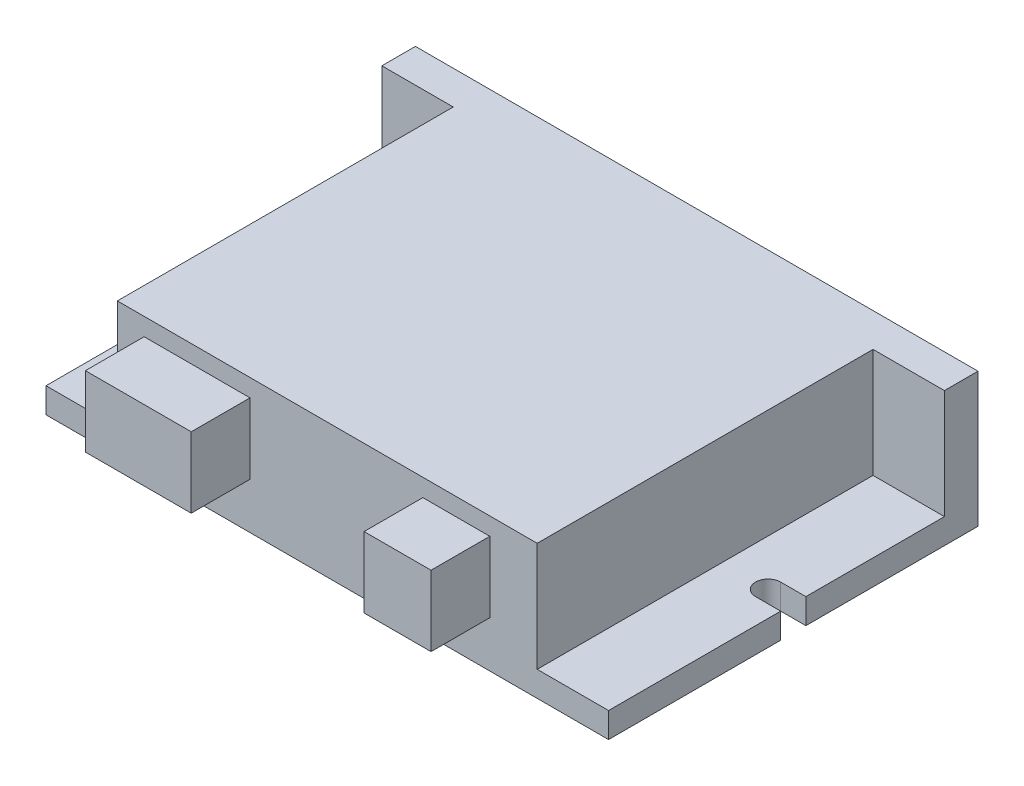
ISO-10303-21;
HEADER;
FILE_DESCRIPTION(('STEP AP214'),'2;1');
FILE_NAME('part.step','',(''),(''),'','','');
FILE_SCHEMA(('AUTOMOTIVE_DESIGN { 1 0 10303 214 1 1 1 1 }'));
ENDSEC;
DATA;
#1=APPLICATION_CONTEXT('core data for automotive mechanical design processes');
#2=APPLICATION_PROTOCOL_DEFINITION('international standard','automotive_design',2000,#1);
#3=PRODUCT_CONTEXT('',#1,'mechanical');
#4=PRODUCT('Part','Part','',(#3));
#5=PRODUCT_RELATED_PRODUCT_CATEGORY('part','',(#4));
#6=PRODUCT_DEFINITION_FORMATION('','',#4);
#7=PRODUCT_DEFINITION_CONTEXT('part definition',#1,'design');
#8=PRODUCT_DEFINITION('design','',#6,#7);
#9=PRODUCT_DEFINITION_SHAPE('','',#8);
#10=(LENGTH_UNIT() NAMED_UNIT(*) SI_UNIT(.MILLI.,.METRE.));
#11=(NAMED_UNIT(*) PLANE_ANGLE_UNIT() SI_UNIT($,.RADIAN.));
#12=(NAMED_UNIT(*) SI_UNIT($,.STERADIAN.) SOLID_ANGLE_UNIT());
#13=UNCERTAINTY_MEASURE_WITH_UNIT(LENGTH_MEASURE(1.E-05),#10,'distance_accuracy_value','');
#14=(GEOMETRIC_REPRESENTATION_CONTEXT(3) GLOBAL_UNCERTAINTY_ASSIGNED_CONTEXT((#13)) GLOBAL_UNIT_ASSIGNED_CONTEXT((#10,
#11,#12)) REPRESENTATION_CONTEXT('',''));
#15=CARTESIAN_POINT('',(0.,0.,0.));
#16=DIRECTION('',(0.,0.,1.));
#17=DIRECTION('',(1.,0.,0.));
#18=AXIS2_PLACEMENT_3D('',#15,#16,#17);
#19=CARTESIAN_POINT('',(-42.545,3.81,27.94));
#20=DIRECTION('',(0.,0.,-1.));
#21=DIRECTION('',(-1.,0.,0.));
#22=AXIS2_PLACEMENT_3D('',#19,#20,#21);
#23=PLANE('',#22);
#24=DIRECTION('',(0.,-1.,0.));
#25=VECTOR('',#24,1.);
#26=CARTESIAN_POINT('',(14.4555598641565,6.985,27.94));
#27=LINE('',#26,#25);
#28=CARTESIAN_POINT('',(14.4555598641565,17.653,27.94));
#29=VERTEX_POINT('',#28);
#30=CARTESIAN_POINT('',(14.4555598641565,6.985,27.94));
#31=VERTEX_POINT('',#30);
#32=EDGE_CURVE('E284',#29,#31,#27,.T.);
#33=ORIENTED_EDGE('',*,*,#32,.F.);
#34=DIRECTION('',(-1.,0.,0.));
#35=VECTOR('',#34,1.);
#36=CARTESIAN_POINT('',(14.4555598641565,17.653,27.94));
#37=LINE('',#36,#35);
#38=CARTESIAN_POINT('',(24.5831077929369,17.653,27.94));
#39=VERTEX_POINT('',#38);
#40=EDGE_CURVE('E271',#39,#29,#37,.T.);
#41=ORIENTED_EDGE('',*,*,#40,.F.);
#42=DIRECTION('',(0.,1.,0.));
#43=VECTOR('',#42,1.);
#44=CARTESIAN_POINT('',(24.5831077929369,6.985,27.94));
#45=LINE('',#44,#43);
#46=CARTESIAN_POINT('',(24.5831077929369,6.985,27.94));
#47=VERTEX_POINT('',#46);
#48=EDGE_CURVE('E275',#47,#39,#45,.T.);
#49=ORIENTED_EDGE('',*,*,#48,.F.);
#50=DIRECTION('',(1.,0.,0.));
#51=VECTOR('',#50,1.);
#52=CARTESIAN_POINT('',(14.4555598641565,6.985,27.94));
#53=LINE('',#52,#51);
#54=EDGE_CURVE('E280',#31,#47,#53,.T.);
#55=ORIENTED_EDGE('',*,*,#54,.F.);
#56=EDGE_LOOP('',(#33,#41,#49,#55));
#57=FACE_BOUND('',#56,.T.);
#58=DIRECTION('',(1.,0.,0.));
#59=VECTOR('',#58,1.);
#60=CARTESIAN_POINT('',(-42.545,0.,27.94));
#61=LINE('',#60,#59);
#62=CARTESIAN_POINT('',(-42.545,0.,27.94));
#63=VERTEX_POINT('',#62);
#64=CARTESIAN_POINT('',(42.545,0.,27.94));
#65=VERTEX_POINT('',#64);
#66=EDGE_CURVE('E461',#63,#65,#61,.T.);
#67=ORIENTED_EDGE('',*,*,#66,.T.);
#68=DIRECTION('',(0.,-1.,0.));
#69=VECTOR('',#68,1.);
#70=CARTESIAN_POINT('',(42.545,3.81,27.94));
#71=LINE('',#70,#69);
#72=CARTESIAN_POINT('',(42.545,3.81,27.94));
#73=VERTEX_POINT('',#72);
#74=EDGE_CURVE('E448',#73,#65,#71,.T.);
#75=ORIENTED_EDGE('',*,*,#74,.F.);
#76=DIRECTION('',(1.,0.,0.));
#77=VECTOR('',#76,1.);
#78=CARTESIAN_POINT('',(-42.545,3.81,27.94));
#79=LINE('',#78,#77);
#80=CARTESIAN_POINT('',(31.75,3.81,27.94));
#81=VERTEX_POINT('',#80);
#82=EDGE_CURVE('E444',#81,#73,#79,.T.);
#83=ORIENTED_EDGE('',*,*,#82,.F.);
#84=DIRECTION('',(0.,-1.,0.));
#85=VECTOR('',#84,1.);
#86=CARTESIAN_POINT('',(31.75,20.32,27.94));
#87=LINE('',#86,#85);
#88=CARTESIAN_POINT('',(31.75,20.32,27.94));
#89=VERTEX_POINT('',#88);
#90=EDGE_CURVE('E425',#89,#81,#87,.T.);
#91=ORIENTED_EDGE('',*,*,#90,.F.);
#92=DIRECTION('',(1.,0.,0.));
#93=VECTOR('',#92,1.);
#94=CARTESIAN_POINT('',(-31.75,20.32,27.94));
#95=LINE('',#94,#93);
#96=CARTESIAN_POINT('',(-31.75,20.32,27.94));
#97=VERTEX_POINT('',#96);
#98=EDGE_CURVE('E404',#97,#89,#95,.T.);
#99=ORIENTED_EDGE('',*,*,#98,.F.);
#100=DIRECTION('',(0.,-1.,0.));
#101=VECTOR('',#100,1.);
#102=CARTESIAN_POINT('',(-31.75,20.32,27.94));
#103=LINE('',#102,#101);
#104=CARTESIAN_POINT('',(-31.75,3.81,27.94));
#105=VERTEX_POINT('',#104);
#106=EDGE_CURVE('E429',#97,#105,#103,.T.);
#107=ORIENTED_EDGE('',*,*,#106,.T.);
#108=CARTESIAN_POINT('',(-42.545,3.81,27.94));
#109=VERTEX_POINT('',#108);
#110=EDGE_CURVE('E445',#109,#105,#79,.T.);
#111=ORIENTED_EDGE('',*,*,#110,.F.);
#112=DIRECTION('',(0.,-1.,0.));
#113=VECTOR('',#112,1.);
#114=CARTESIAN_POINT('',(-42.545,3.81,27.94));
#115=LINE('',#114,#113);
#116=EDGE_CURVE('E467',#109,#63,#115,.T.);
#117=ORIENTED_EDGE('',*,*,#116,.T.);
#118=EDGE_LOOP('',(#67,#75,#83,#91,#99,#107,#111,#117));
#119=FACE_BOUND('',#118,.T.);
#120=DIRECTION('',(0.,-1.,0.));
#121=VECTOR('',#120,1.);
#122=CARTESIAN_POINT('',(-27.6992763864077,6.985,27.94));
#123=LINE('',#122,#121);
#124=CARTESIAN_POINT('',(-27.6992763864077,17.653,27.94));
#125=VERTEX_POINT('',#124);
#126=CARTESIAN_POINT('',(-27.6992763864077,6.985,27.94));
#127=VERTEX_POINT('',#126);
#128=EDGE_CURVE('E241',#125,#127,#123,.T.);
#129=ORIENTED_EDGE('',*,*,#128,.F.);
#130=DIRECTION('',(-1.,0.,0.));
#131=VECTOR('',#130,1.);
#132=CARTESIAN_POINT('',(-27.6992763864077,17.653,27.94));
#133=LINE('',#132,#131);
#134=CARTESIAN_POINT('',(-11.6856322255158,17.653,27.94));
#135=VERTEX_POINT('',#134);
#136=EDGE_CURVE('E238',#135,#125,#133,.T.);
#137=ORIENTED_EDGE('',*,*,#136,.F.);
#138=DIRECTION('',(0.,1.,0.));
#139=VECTOR('',#138,1.);
#140=CARTESIAN_POINT('',(-11.6856322255158,6.985,27.94));
#141=LINE('',#140,#139);
#142=CARTESIAN_POINT('',(-11.6856322255158,6.985,27.94));
#143=VERTEX_POINT('',#142);
#144=EDGE_CURVE('E66',#143,#135,#141,.T.);
#145=ORIENTED_EDGE('',*,*,#144,.F.);
#146=DIRECTION('',(1.,0.,0.));
#147=VECTOR('',#146,1.);
#148=CARTESIAN_POINT('',(-27.6992763864077,6.985,27.94));
#149=LINE('',#148,#147);
#150=EDGE_CURVE('E61',#127,#143,#149,.T.);
#151=ORIENTED_EDGE('',*,*,#150,.F.);
#152=EDGE_LOOP('',(#129,#137,#145,#151));
#153=FACE_BOUND('',#152,.T.);
#154=ADVANCED_FACE('F45',(#57,#119,#153),#23,.F.);
#155=CARTESIAN_POINT('',(42.545,3.81,27.94));
#156=DIRECTION('',(-1.,0.,0.));
#157=DIRECTION('',(0.,0.,1.));
#158=AXIS2_PLACEMENT_3D('',#155,#156,#157);
#159=PLANE('',#158);
#160=DIRECTION('',(0.,0.,-1.));
#161=VECTOR('',#160,1.);
#162=CARTESIAN_POINT('',(42.545,3.81,27.94));
#163=LINE('',#162,#161);
#164=CARTESIAN_POINT('',(42.545,3.81,-1.905));
#165=VERTEX_POINT('',#164);
#166=CARTESIAN_POINT('',(42.545,3.81,-22.86));
#167=VERTEX_POINT('',#166);
#168=EDGE_CURVE('E439',#165,#167,#163,.T.);
#169=ORIENTED_EDGE('',*,*,#168,.F.);
#170=DIRECTION('',(0.,1.,0.));
#171=VECTOR('',#170,1.);
#172=CARTESIAN_POINT('',(42.545,0.,-1.905));
#173=LINE('',#172,#171);
#174=CARTESIAN_POINT('',(42.545,0.,-1.905));
#175=VERTEX_POINT('',#174);
#176=EDGE_CURVE('E318',#175,#165,#173,.T.);
#177=ORIENTED_EDGE('',*,*,#176,.F.);
#178=DIRECTION('',(0.,0.,-1.));
#179=VECTOR('',#178,1.);
#180=CARTESIAN_POINT('',(42.545,0.,27.94));
#181=LINE('',#180,#179);
#182=CARTESIAN_POINT('',(42.545,0.,-27.94));
#183=VERTEX_POINT('',#182);
#184=EDGE_CURVE('E433',#175,#183,#181,.T.);
#185=ORIENTED_EDGE('',*,*,#184,.T.);
#186=DIRECTION('',(0.,-1.,0.));
#187=VECTOR('',#186,1.);
#188=CARTESIAN_POINT('',(42.545,3.81,-27.94));
#189=LINE('',#188,#187);
#190=CARTESIAN_POINT('',(42.545,20.32,-27.94));
#191=VERTEX_POINT('',#190);
#192=EDGE_CURVE('E11',#191,#183,#189,.T.);
#193=ORIENTED_EDGE('',*,*,#192,.F.);
#194=DIRECTION('',(0.,0.,1.));
#195=VECTOR('',#194,1.);
#196=CARTESIAN_POINT('',(42.545,20.32,-27.94));
#197=LINE('',#196,#195);
#198=CARTESIAN_POINT('',(42.545,20.32,-22.86));
#199=VERTEX_POINT('',#198);
#200=EDGE_CURVE('E373',#191,#199,#197,.T.);
#201=ORIENTED_EDGE('',*,*,#200,.T.);
#202=DIRECTION('',(0.,-1.,0.));
#203=VECTOR('',#202,1.);
#204=CARTESIAN_POINT('',(42.545,105.561506908313,-22.86));
#205=LINE('',#204,#203);
#206=EDGE_CURVE('E390',#199,#167,#205,.T.);
#207=ORIENTED_EDGE('',*,*,#206,.T.);
#208=EDGE_LOOP('',(#169,#177,#185,#193,#201,#207));
#209=FACE_BOUND('',#208,.T.);
#210=ADVANCED_FACE('F503',(#209),#159,.F.);
#211=CARTESIAN_POINT('',(-42.545,3.81,27.94));
#212=DIRECTION('',(1.,0.,0.));
#213=DIRECTION('',(0.,0.,-1.));
#214=AXIS2_PLACEMENT_3D('',#211,#212,#213);
#215=PLANE('',#214);
#216=DIRECTION('',(0.,0.,1.));
#217=VECTOR('',#216,1.);
#218=CARTESIAN_POINT('',(-42.545,3.81,27.94));
#219=LINE('',#218,#217);
#220=CARTESIAN_POINT('',(-42.545,3.81,1.905));
#221=VERTEX_POINT('',#220);
#222=EDGE_CURVE('E438',#221,#109,#219,.T.);
#223=ORIENTED_EDGE('',*,*,#222,.F.);
#224=DIRECTION('',(0.,1.,0.));
#225=VECTOR('',#224,1.);
#226=CARTESIAN_POINT('',(-42.545,0.,1.905));
#227=LINE('',#226,#225);
#228=CARTESIAN_POINT('',(-42.545,0.,1.905));
#229=VERTEX_POINT('',#228);
#230=EDGE_CURVE('E248',#229,#221,#227,.T.);
#231=ORIENTED_EDGE('',*,*,#230,.F.);
#232=DIRECTION('',(0.,0.,1.));
#233=VECTOR('',#232,1.);
#234=CARTESIAN_POINT('',(-42.545,0.,27.94));
#235=LINE('',#234,#233);
#236=EDGE_CURVE('E456',#229,#63,#235,.T.);
#237=ORIENTED_EDGE('',*,*,#236,.T.);
#238=ORIENTED_EDGE('',*,*,#116,.F.);
#239=EDGE_LOOP('',(#223,#231,#237,#238));
#240=FACE_BOUND('',#239,.T.);
#241=ADVANCED_FACE('F522',(#240),#215,.F.);
#242=CARTESIAN_POINT('',(0.,3.81,0.));
#243=DIRECTION('',(0.,-1.,0.));
#244=DIRECTION('',(0.,0.,-1.));
#245=AXIS2_PLACEMENT_3D('',#242,#243,#244);
#246=PLANE('',#245);
#247=CARTESIAN_POINT('',(-38.735,3.81,0.));
#248=DIRECTION('',(0.,-1.,0.));
#249=DIRECTION('',(0.,0.,-1.));
#250=AXIS2_PLACEMENT_3D('',#247,#248,#249);
#251=CIRCLE('',#250,1.905);
#252=CARTESIAN_POINT('',(-38.735,3.81,-1.905));
#253=VERTEX_POINT('',#252);
#254=CARTESIAN_POINT('',(-38.735,3.81,1.905));
#255=VERTEX_POINT('',#254);
#256=EDGE_CURVE('E356',#253,#255,#251,.T.);
#257=ORIENTED_EDGE('',*,*,#256,.T.);
#258=DIRECTION('',(-1.,0.,0.));
#259=VECTOR('',#258,1.);
#260=CARTESIAN_POINT('',(0.,3.81,1.905));
#261=LINE('',#260,#259);
#262=EDGE_CURVE('E352',#255,#221,#261,.T.);
#263=ORIENTED_EDGE('',*,*,#262,.T.);
#264=ORIENTED_EDGE('',*,*,#222,.T.);
#265=ORIENTED_EDGE('',*,*,#110,.T.);
#266=DIRECTION('',(0.,0.,1.));
#267=VECTOR('',#266,1.);
#268=CARTESIAN_POINT('',(-31.75,3.81,27.94));
#269=LINE('',#268,#267);
#270=CARTESIAN_POINT('',(-31.75,3.81,-22.86));
#271=VERTEX_POINT('',#270);
#272=EDGE_CURVE('E386',#271,#105,#269,.T.);
#273=ORIENTED_EDGE('',*,*,#272,.F.);
#274=DIRECTION('',(1.,0.,0.));
#275=VECTOR('',#274,1.);
#276=CARTESIAN_POINT('',(-42.545,3.81,-22.86));
#277=LINE('',#276,#275);
#278=CARTESIAN_POINT('',(-42.545,3.81,-22.86));
#279=VERTEX_POINT('',#278);
#280=EDGE_CURVE('E387',#279,#271,#277,.T.);
#281=ORIENTED_EDGE('',*,*,#280,.F.);
#282=CARTESIAN_POINT('',(-42.545,3.81,-1.905));
#283=VERTEX_POINT('',#282);
#284=EDGE_CURVE('E440',#279,#283,#219,.T.);
#285=ORIENTED_EDGE('',*,*,#284,.T.);
#286=DIRECTION('',(1.,0.,0.));
#287=VECTOR('',#286,1.);
#288=CARTESIAN_POINT('',(0.,3.81,-1.905));
#289=LINE('',#288,#287);
#290=EDGE_CURVE('E317',#283,#253,#289,.T.);
#291=ORIENTED_EDGE('',*,*,#290,.T.);
#292=EDGE_LOOP('',(#257,#263,#264,#265,#273,#281,#285,#291));
#293=FACE_BOUND('',#292,.T.);
#294=ADVANCED_FACE('F490',(#293),#246,.F.);
#295=CARTESIAN_POINT('',(38.735,3.81,0.));
#296=DIRECTION('',(0.,-1.,0.));
#297=DIRECTION('',(0.,0.,-1.));
#298=AXIS2_PLACEMENT_3D('',#295,#296,#297);
#299=CIRCLE('',#298,1.905);
#300=CARTESIAN_POINT('',(38.735,3.81,1.905));
#301=VERTEX_POINT('',#300);
#302=CARTESIAN_POINT('',(38.735,3.81,-1.905));
#303=VERTEX_POINT('',#302);
#304=EDGE_CURVE('E368',#301,#303,#299,.T.);
#305=ORIENTED_EDGE('',*,*,#304,.T.);
#306=DIRECTION('',(1.,0.,0.));
#307=VECTOR('',#306,1.);
#308=CARTESIAN_POINT('',(0.,3.81,-1.905));
#309=LINE('',#308,#307);
#310=EDGE_CURVE('E364',#303,#165,#309,.T.);
#311=ORIENTED_EDGE('',*,*,#310,.T.);
#312=ORIENTED_EDGE('',*,*,#168,.T.);
#313=CARTESIAN_POINT('',(31.75,3.81,-22.86));
#314=VERTEX_POINT('',#313);
#315=EDGE_CURVE('E372',#314,#167,#277,.T.);
#316=ORIENTED_EDGE('',*,*,#315,.F.);
#317=DIRECTION('',(0.,0.,-1.));
#318=VECTOR('',#317,1.);
#319=CARTESIAN_POINT('',(31.75,3.81,27.94));
#320=LINE('',#319,#318);
#321=EDGE_CURVE('E405',#81,#314,#320,.T.);
#322=ORIENTED_EDGE('',*,*,#321,.F.);
#323=ORIENTED_EDGE('',*,*,#82,.T.);
#324=CARTESIAN_POINT('',(42.545,3.81,1.905));
#325=VERTEX_POINT('',#324);
#326=EDGE_CURVE('E434',#73,#325,#163,.T.);
#327=ORIENTED_EDGE('',*,*,#326,.T.);
#328=DIRECTION('',(-1.,0.,0.));
#329=VECTOR('',#328,1.);
#330=CARTESIAN_POINT('',(0.,3.81,1.905));
#331=LINE('',#330,#329);
#332=EDGE_CURVE('E360',#325,#301,#331,.T.);
#333=ORIENTED_EDGE('',*,*,#332,.T.);
#334=EDGE_LOOP('',(#305,#311,#312,#316,#322,#323,#327,#333));
#335=FACE_BOUND('',#334,.T.);
#336=ADVANCED_FACE('F563',(#335),#246,.F.);
#337=CARTESIAN_POINT('',(42.545,0.,1.90500000000001));
#338=VERTEX_POINT('',#337);
#339=EDGE_CURVE('E449',#65,#338,#181,.T.);
#340=ORIENTED_EDGE('',*,*,#339,.T.);
#341=DIRECTION('',(0.,1.,0.));
#342=VECTOR('',#341,1.);
#343=CARTESIAN_POINT('',(42.545,0.,1.905));
#344=LINE('',#343,#342);
#345=EDGE_CURVE('E321',#338,#325,#344,.T.);
#346=ORIENTED_EDGE('',*,*,#345,.T.);
#347=ORIENTED_EDGE('',*,*,#326,.F.);
#348=ORIENTED_EDGE('',*,*,#74,.T.);
#349=EDGE_LOOP('',(#340,#346,#347,#348));
#350=FACE_BOUND('',#349,.T.);
#351=ADVANCED_FACE('F47',(#350),#159,.F.);
#352=CARTESIAN_POINT('',(-42.545,3.81,-27.94));
#353=DIRECTION('',(0.,0.,1.));
#354=DIRECTION('',(1.,0.,0.));
#355=AXIS2_PLACEMENT_3D('',#352,#353,#354);
#356=PLANE('',#355);
#357=DIRECTION('',(-1.,0.,0.));
#358=VECTOR('',#357,1.);
#359=CARTESIAN_POINT('',(-42.545,0.,-27.94));
#360=LINE('',#359,#358);
#361=CARTESIAN_POINT('',(-42.545,0.,-27.94));
#362=VERTEX_POINT('',#361);
#363=EDGE_CURVE('E453',#183,#362,#360,.T.);
#364=ORIENTED_EDGE('',*,*,#363,.T.);
#365=DIRECTION('',(0.,-1.,0.));
#366=VECTOR('',#365,1.);
#367=CARTESIAN_POINT('',(-42.545,3.81,-27.94));
#368=LINE('',#367,#366);
#369=CARTESIAN_POINT('',(-42.545,20.32,-27.94));
#370=VERTEX_POINT('',#369);
#371=EDGE_CURVE('E54',#370,#362,#368,.T.);
#372=ORIENTED_EDGE('',*,*,#371,.F.);
#373=DIRECTION('',(1.,0.,0.));
#374=VECTOR('',#373,1.);
#375=CARTESIAN_POINT('',(-42.545,20.32,-27.94));
#376=LINE('',#375,#374);
#377=EDGE_CURVE('E378',#370,#191,#376,.T.);
#378=ORIENTED_EDGE('',*,*,#377,.T.);
#379=ORIENTED_EDGE('',*,*,#192,.T.);
#380=EDGE_LOOP('',(#364,#372,#378,#379));
#381=FACE_BOUND('',#380,.T.);
#382=ADVANCED_FACE('F500',(#381),#356,.F.);
#383=CARTESIAN_POINT('',(-42.545,0.,-1.905));
#384=VERTEX_POINT('',#383);
#385=EDGE_CURVE('E457',#362,#384,#235,.T.);
#386=ORIENTED_EDGE('',*,*,#385,.T.);
#387=DIRECTION('',(0.,1.,0.));
#388=VECTOR('',#387,1.);
#389=CARTESIAN_POINT('',(-42.545,0.,-1.905));
#390=LINE('',#389,#388);
#391=EDGE_CURVE('E333',#384,#283,#390,.T.);
#392=ORIENTED_EDGE('',*,*,#391,.T.);
#393=ORIENTED_EDGE('',*,*,#284,.F.);
#394=DIRECTION('',(0.,-1.,0.));
#395=VECTOR('',#394,1.);
#396=CARTESIAN_POINT('',(-42.545,105.561506908313,-22.86));
#397=LINE('',#396,#395);
#398=CARTESIAN_POINT('',(-42.545,20.32,-22.86));
#399=VERTEX_POINT('',#398);
#400=EDGE_CURVE('E394',#399,#279,#397,.T.);
#401=ORIENTED_EDGE('',*,*,#400,.F.);
#402=DIRECTION('',(0.,0.,-1.));
#403=VECTOR('',#402,1.);
#404=CARTESIAN_POINT('',(-42.545,20.32,-27.94));
#405=LINE('',#404,#403);
#406=EDGE_CURVE('E382',#399,#370,#405,.T.);
#407=ORIENTED_EDGE('',*,*,#406,.T.);
#408=ORIENTED_EDGE('',*,*,#371,.T.);
#409=EDGE_LOOP('',(#386,#392,#393,#401,#407,#408));
#410=FACE_BOUND('',#409,.T.);
#411=ADVANCED_FACE('F474',(#410),#215,.F.);
#412=CARTESIAN_POINT('',(0.,0.,0.));
#413=DIRECTION('',(0.,-1.,0.));
#414=DIRECTION('',(0.,0.,-1.));
#415=AXIS2_PLACEMENT_3D('',#412,#413,#414);
#416=PLANE('',#415);
#417=DIRECTION('',(-1.,0.,0.));
#418=VECTOR('',#417,1.);
#419=CARTESIAN_POINT('',(38.735,0.,-1.905));
#420=LINE('',#419,#418);
#421=CARTESIAN_POINT('',(38.735,0.,-1.905));
#422=VERTEX_POINT('',#421);
#423=EDGE_CURVE('E308',#175,#422,#420,.T.);
#424=ORIENTED_EDGE('',*,*,#423,.T.);
#425=CARTESIAN_POINT('',(38.735,0.,0.));
#426=DIRECTION('',(0.,1.,0.));
#427=DIRECTION('',(0.,0.,1.));
#428=AXIS2_PLACEMENT_3D('',#425,#426,#427);
#429=CIRCLE('',#428,1.905);
#430=CARTESIAN_POINT('',(38.735,0.,1.905));
#431=VERTEX_POINT('',#430);
#432=EDGE_CURVE('E299',#422,#431,#429,.T.);
#433=ORIENTED_EDGE('',*,*,#432,.T.);
#434=DIRECTION('',(1.,0.,0.));
#435=VECTOR('',#434,1.);
#436=CARTESIAN_POINT('',(38.735,0.,1.905));
#437=LINE('',#436,#435);
#438=EDGE_CURVE('E303',#431,#338,#437,.T.);
#439=ORIENTED_EDGE('',*,*,#438,.T.);
#440=ORIENTED_EDGE('',*,*,#339,.F.);
#441=ORIENTED_EDGE('',*,*,#66,.F.);
#442=ORIENTED_EDGE('',*,*,#236,.F.);
#443=DIRECTION('',(1.,0.,0.));
#444=VECTOR('',#443,1.);
#445=CARTESIAN_POINT('',(-38.735,0.,1.905));
#446=LINE('',#445,#444);
#447=CARTESIAN_POINT('',(-38.735,0.,1.905));
#448=VERTEX_POINT('',#447);
#449=EDGE_CURVE('E332',#229,#448,#446,.T.);
#450=ORIENTED_EDGE('',*,*,#449,.T.);
#451=CARTESIAN_POINT('',(-38.735,0.,0.));
#452=DIRECTION('',(0.,1.,0.));
#453=DIRECTION('',(0.,0.,-1.));
#454=AXIS2_PLACEMENT_3D('',#451,#452,#453);
#455=CIRCLE('',#454,1.905);
#456=CARTESIAN_POINT('',(-38.735,0.,-1.905));
#457=VERTEX_POINT('',#456);
#458=EDGE_CURVE('E304',#448,#457,#455,.T.);
#459=ORIENTED_EDGE('',*,*,#458,.T.);
#460=DIRECTION('',(-1.,0.,0.));
#461=VECTOR('',#460,1.);
#462=CARTESIAN_POINT('',(-38.735,0.,-1.905));
#463=LINE('',#462,#461);
#464=EDGE_CURVE('E342',#457,#384,#463,.T.);
#465=ORIENTED_EDGE('',*,*,#464,.T.);
#466=ORIENTED_EDGE('',*,*,#385,.F.);
#467=ORIENTED_EDGE('',*,*,#363,.F.);
#468=ORIENTED_EDGE('',*,*,#184,.F.);
#469=EDGE_LOOP('',(#424,#433,#439,#440,#441,#442,#450,#459,#465,#466,#467,#468));
#470=FACE_BOUND('',#469,.T.);
#471=ADVANCED_FACE('F481',(#470),#416,.T.);
#472=CARTESIAN_POINT('',(-31.75,20.32,27.94));
#473=DIRECTION('',(1.,0.,0.));
#474=DIRECTION('',(0.,0.,-1.));
#475=AXIS2_PLACEMENT_3D('',#472,#473,#474);
#476=PLANE('',#475);
#477=ORIENTED_EDGE('',*,*,#272,.T.);
#478=ORIENTED_EDGE('',*,*,#106,.F.);
#479=DIRECTION('',(0.,0.,1.));
#480=VECTOR('',#479,1.);
#481=CARTESIAN_POINT('',(-31.75,20.32,27.94));
#482=LINE('',#481,#480);
#483=CARTESIAN_POINT('',(-31.75,20.32,-22.86));
#484=VERTEX_POINT('',#483);
#485=EDGE_CURVE('E400',#484,#97,#482,.T.);
#486=ORIENTED_EDGE('',*,*,#485,.F.);
#487=DIRECTION('',(0.,-1.,0.));
#488=VECTOR('',#487,1.);
#489=CARTESIAN_POINT('',(-31.75,20.32,-22.86));
#490=LINE('',#489,#488);
#491=EDGE_CURVE('E412',#484,#271,#490,.T.);
#492=ORIENTED_EDGE('',*,*,#491,.T.);
#493=EDGE_LOOP('',(#477,#478,#486,#492));
#494=FACE_BOUND('',#493,.T.);
#495=ADVANCED_FACE('F539',(#494),#476,.F.);
#496=CARTESIAN_POINT('',(31.75,20.32,27.94));
#497=DIRECTION('',(-1.,0.,0.));
#498=DIRECTION('',(0.,0.,1.));
#499=AXIS2_PLACEMENT_3D('',#496,#497,#498);
#500=PLANE('',#499);
#501=ORIENTED_EDGE('',*,*,#321,.T.);
#502=DIRECTION('',(0.,-1.,0.));
#503=VECTOR('',#502,1.);
#504=CARTESIAN_POINT('',(31.75,20.32,-22.86));
#505=LINE('',#504,#503);
#506=CARTESIAN_POINT('',(31.75,20.32,-22.86));
#507=VERTEX_POINT('',#506);
#508=EDGE_CURVE('E422',#507,#314,#505,.T.);
#509=ORIENTED_EDGE('',*,*,#508,.F.);
#510=DIRECTION('',(0.,0.,-1.));
#511=VECTOR('',#510,1.);
#512=CARTESIAN_POINT('',(31.75,20.32,27.94));
#513=LINE('',#512,#511);
#514=EDGE_CURVE('E408',#89,#507,#513,.T.);
#515=ORIENTED_EDGE('',*,*,#514,.F.);
#516=ORIENTED_EDGE('',*,*,#90,.T.);
#517=EDGE_LOOP('',(#501,#509,#515,#516));
#518=FACE_BOUND('',#517,.T.);
#519=ADVANCED_FACE('F536',(#518),#500,.F.);
#520=CARTESIAN_POINT('',(0.,20.32,0.));
#521=DIRECTION('',(0.,-1.,0.));
#522=DIRECTION('',(0.,0.,-1.));
#523=AXIS2_PLACEMENT_3D('',#520,#521,#522);
#524=PLANE('',#523);
#525=ORIENTED_EDGE('',*,*,#485,.T.);
#526=ORIENTED_EDGE('',*,*,#98,.T.);
#527=ORIENTED_EDGE('',*,*,#514,.T.);
#528=DIRECTION('',(-1.,0.,0.));
#529=VECTOR('',#528,1.);
#530=CARTESIAN_POINT('',(-42.545,20.32,-22.86));
#531=LINE('',#530,#529);
#532=EDGE_CURVE('E379',#199,#507,#531,.T.);
#533=ORIENTED_EDGE('',*,*,#532,.F.);
#534=ORIENTED_EDGE('',*,*,#200,.F.);
#535=ORIENTED_EDGE('',*,*,#377,.F.);
#536=ORIENTED_EDGE('',*,*,#406,.F.);
#537=EDGE_CURVE('E377',#484,#399,#531,.T.);
#538=ORIENTED_EDGE('',*,*,#537,.F.);
#539=EDGE_LOOP('',(#525,#526,#527,#533,#534,#535,#536,#538));
#540=FACE_BOUND('',#539,.T.);
#541=ADVANCED_FACE('F498',(#540),#524,.F.);
#542=CARTESIAN_POINT('',(-42.545,105.561506908313,-22.86));
#543=DIRECTION('',(0.,0.,-1.));
#544=DIRECTION('',(-1.,0.,0.));
#545=AXIS2_PLACEMENT_3D('',#542,#543,#544);
#546=PLANE('',#545);
#547=ORIENTED_EDGE('',*,*,#280,.T.);
#548=ORIENTED_EDGE('',*,*,#491,.F.);
#549=ORIENTED_EDGE('',*,*,#537,.T.);
#550=ORIENTED_EDGE('',*,*,#400,.T.);
#551=EDGE_LOOP('',(#547,#548,#549,#550));
#552=FACE_BOUND('',#551,.T.);
#553=ADVANCED_FACE('F494',(#552),#546,.F.);
#554=ORIENTED_EDGE('',*,*,#532,.T.);
#555=ORIENTED_EDGE('',*,*,#508,.T.);
#556=ORIENTED_EDGE('',*,*,#315,.T.);
#557=ORIENTED_EDGE('',*,*,#206,.F.);
#558=EDGE_LOOP('',(#554,#555,#556,#557));
#559=FACE_BOUND('',#558,.T.);
#560=ADVANCED_FACE('F511',(#559),#546,.F.);
#561=CARTESIAN_POINT('',(-38.735,0.,0.));
#562=DIRECTION('',(0.,1.,0.));
#563=DIRECTION('',(0.,0.,1.));
#564=AXIS2_PLACEMENT_3D('',#561,#562,#563);
#565=CYLINDRICAL_SURFACE('',#564,1.905);
#566=DIRECTION('',(0.,1.,0.));
#567=VECTOR('',#566,1.);
#568=CARTESIAN_POINT('',(-38.735,0.,-1.905));
#569=LINE('',#568,#567);
#570=EDGE_CURVE('E328',#457,#253,#569,.T.);
#571=ORIENTED_EDGE('',*,*,#570,.F.);
#572=ORIENTED_EDGE('',*,*,#458,.F.);
#573=DIRECTION('',(0.,1.,0.));
#574=VECTOR('',#573,1.);
#575=CARTESIAN_POINT('',(-38.735,0.,1.905));
#576=LINE('',#575,#574);
#577=EDGE_CURVE('E243',#448,#255,#576,.T.);
#578=ORIENTED_EDGE('',*,*,#577,.T.);
#579=ORIENTED_EDGE('',*,*,#256,.F.);
#580=EDGE_LOOP('',(#571,#572,#578,#579));
#581=FACE_BOUND('',#580,.T.);
#582=ADVANCED_FACE('F589',(#581),#565,.F.);
#583=CARTESIAN_POINT('',(-38.735,0.,1.905));
#584=DIRECTION('',(0.,0.,1.));
#585=DIRECTION('',(1.,0.,0.));
#586=AXIS2_PLACEMENT_3D('',#583,#584,#585);
#587=PLANE('',#586);
#588=ORIENTED_EDGE('',*,*,#577,.F.);
#589=ORIENTED_EDGE('',*,*,#449,.F.);
#590=ORIENTED_EDGE('',*,*,#230,.T.);
#591=ORIENTED_EDGE('',*,*,#262,.F.);
#592=EDGE_LOOP('',(#588,#589,#590,#591));
#593=FACE_BOUND('',#592,.T.);
#594=ADVANCED_FACE('F592',(#593),#587,.F.);
#595=CARTESIAN_POINT('',(-38.735,0.,-1.905));
#596=DIRECTION('',(0.,0.,-1.));
#597=DIRECTION('',(-1.,0.,0.));
#598=AXIS2_PLACEMENT_3D('',#595,#596,#597);
#599=PLANE('',#598);
#600=ORIENTED_EDGE('',*,*,#391,.F.);
#601=ORIENTED_EDGE('',*,*,#464,.F.);
#602=ORIENTED_EDGE('',*,*,#570,.T.);
#603=ORIENTED_EDGE('',*,*,#290,.F.);
#604=EDGE_LOOP('',(#600,#601,#602,#603));
#605=FACE_BOUND('',#604,.T.);
#606=ADVANCED_FACE('F486',(#605),#599,.F.);
#607=CARTESIAN_POINT('',(38.735,0.,0.));
#608=DIRECTION('',(0.,1.,0.));
#609=DIRECTION('',(0.,0.,1.));
#610=AXIS2_PLACEMENT_3D('',#607,#608,#609);
#611=CYLINDRICAL_SURFACE('',#610,1.905);
#612=DIRECTION('',(0.,1.,0.));
#613=VECTOR('',#612,1.);
#614=CARTESIAN_POINT('',(38.735,0.,1.905));
#615=LINE('',#614,#613);
#616=EDGE_CURVE('E312',#431,#301,#615,.T.);
#617=ORIENTED_EDGE('',*,*,#616,.F.);
#618=ORIENTED_EDGE('',*,*,#432,.F.);
#619=DIRECTION('',(0.,1.,0.));
#620=VECTOR('',#619,1.);
#621=CARTESIAN_POINT('',(38.735,0.,-1.905));
#622=LINE('',#621,#620);
#623=EDGE_CURVE('E313',#422,#303,#622,.T.);
#624=ORIENTED_EDGE('',*,*,#623,.T.);
#625=ORIENTED_EDGE('',*,*,#304,.F.);
#626=EDGE_LOOP('',(#617,#618,#624,#625));
#627=FACE_BOUND('',#626,.T.);
#628=ADVANCED_FACE('F571',(#627),#611,.F.);
#629=CARTESIAN_POINT('',(38.735,0.,-1.905));
#630=DIRECTION('',(0.,0.,-1.));
#631=DIRECTION('',(-1.,0.,0.));
#632=AXIS2_PLACEMENT_3D('',#629,#630,#631);
#633=PLANE('',#632);
#634=ORIENTED_EDGE('',*,*,#623,.F.);
#635=ORIENTED_EDGE('',*,*,#423,.F.);
#636=ORIENTED_EDGE('',*,*,#176,.T.);
#637=ORIENTED_EDGE('',*,*,#310,.F.);
#638=EDGE_LOOP('',(#634,#635,#636,#637));
#639=FACE_BOUND('',#638,.T.);
#640=ADVANCED_FACE('F576',(#639),#633,.F.);
#641=CARTESIAN_POINT('',(38.735,0.,1.905));
#642=DIRECTION('',(0.,0.,1.));
#643=DIRECTION('',(1.,0.,0.));
#644=AXIS2_PLACEMENT_3D('',#641,#642,#643);
#645=PLANE('',#644);
#646=ORIENTED_EDGE('',*,*,#345,.F.);
#647=ORIENTED_EDGE('',*,*,#438,.F.);
#648=ORIENTED_EDGE('',*,*,#616,.T.);
#649=ORIENTED_EDGE('',*,*,#332,.F.);
#650=EDGE_LOOP('',(#646,#647,#648,#649));
#651=FACE_BOUND('',#650,.T.);
#652=ADVANCED_FACE('F574',(#651),#645,.F.);
#653=CARTESIAN_POINT('',(14.4555598641565,6.985,36.83));
#654=DIRECTION('',(1.,0.,0.));
#655=DIRECTION('',(0.,0.,-1.));
#656=AXIS2_PLACEMENT_3D('',#653,#654,#655);
#657=PLANE('',#656);
#658=ORIENTED_EDGE('',*,*,#32,.T.);
#659=DIRECTION('',(0.,0.,-1.));
#660=VECTOR('',#659,1.);
#661=CARTESIAN_POINT('',(14.4555598641565,6.985,36.83));
#662=LINE('',#661,#660);
#663=CARTESIAN_POINT('',(14.4555598641565,6.985,36.83));
#664=VERTEX_POINT('',#663);
#665=EDGE_CURVE('E254',#664,#31,#662,.T.);
#666=ORIENTED_EDGE('',*,*,#665,.F.);
#667=DIRECTION('',(0.,-1.,0.));
#668=VECTOR('',#667,1.);
#669=CARTESIAN_POINT('',(14.4555598641565,6.985,36.83));
#670=LINE('',#669,#668);
#671=CARTESIAN_POINT('',(14.4555598641565,17.653,36.83));
#672=VERTEX_POINT('',#671);
#673=EDGE_CURVE('E276',#672,#664,#670,.T.);
#674=ORIENTED_EDGE('',*,*,#673,.F.);
#675=DIRECTION('',(0.,0.,-1.));
#676=VECTOR('',#675,1.);
#677=CARTESIAN_POINT('',(14.4555598641565,17.653,36.83));
#678=LINE('',#677,#676);
#679=EDGE_CURVE('E266',#672,#29,#678,.T.);
#680=ORIENTED_EDGE('',*,*,#679,.T.);
#681=EDGE_LOOP('',(#658,#666,#674,#680));
#682=FACE_BOUND('',#681,.T.);
#683=ADVANCED_FACE('F582',(#682),#657,.F.);
#684=CARTESIAN_POINT('',(14.4555598641565,6.985,36.83));
#685=DIRECTION('',(0.,1.,0.));
#686=DIRECTION('',(0.,0.,1.));
#687=AXIS2_PLACEMENT_3D('',#684,#685,#686);
#688=PLANE('',#687);
#689=ORIENTED_EDGE('',*,*,#54,.T.);
#690=DIRECTION('',(0.,0.,-1.));
#691=VECTOR('',#690,1.);
#692=CARTESIAN_POINT('',(24.5831077929369,6.985,36.83));
#693=LINE('',#692,#691);
#694=CARTESIAN_POINT('',(24.5831077929369,6.985,36.83));
#695=VERTEX_POINT('',#694);
#696=EDGE_CURVE('E258',#695,#47,#693,.T.);
#697=ORIENTED_EDGE('',*,*,#696,.F.);
#698=DIRECTION('',(1.,0.,0.));
#699=VECTOR('',#698,1.);
#700=CARTESIAN_POINT('',(14.4555598641565,6.985,36.83));
#701=LINE('',#700,#699);
#702=EDGE_CURVE('E293',#664,#695,#701,.T.);
#703=ORIENTED_EDGE('',*,*,#702,.F.);
#704=ORIENTED_EDGE('',*,*,#665,.T.);
#705=EDGE_LOOP('',(#689,#697,#703,#704));
#706=FACE_BOUND('',#705,.T.);
#707=ADVANCED_FACE('F707',(#706),#688,.F.);
#708=CARTESIAN_POINT('',(24.5831077929369,6.985,36.83));
#709=DIRECTION('',(-1.,0.,0.));
#710=DIRECTION('',(0.,0.,1.));
#711=AXIS2_PLACEMENT_3D('',#708,#709,#710);
#712=PLANE('',#711);
#713=ORIENTED_EDGE('',*,*,#48,.T.);
#714=DIRECTION('',(0.,0.,-1.));
#715=VECTOR('',#714,1.);
#716=CARTESIAN_POINT('',(24.5831077929369,17.653,36.83));
#717=LINE('',#716,#715);
#718=CARTESIAN_POINT('',(24.5831077929369,17.653,36.83));
#719=VERTEX_POINT('',#718);
#720=EDGE_CURVE('E262',#719,#39,#717,.T.);
#721=ORIENTED_EDGE('',*,*,#720,.F.);
#722=DIRECTION('',(0.,1.,0.));
#723=VECTOR('',#722,1.);
#724=CARTESIAN_POINT('',(24.5831077929369,6.985,36.83));
#725=LINE('',#724,#723);
#726=EDGE_CURVE('E290',#695,#719,#725,.T.);
#727=ORIENTED_EDGE('',*,*,#726,.F.);
#728=ORIENTED_EDGE('',*,*,#696,.T.);
#729=EDGE_LOOP('',(#713,#721,#727,#728));
#730=FACE_BOUND('',#729,.T.);
#731=ADVANCED_FACE('F717',(#730),#712,.F.);
#732=CARTESIAN_POINT('',(14.4555598641565,17.653,36.83));
#733=DIRECTION('',(0.,-1.,0.));
#734=DIRECTION('',(0.,0.,-1.));
#735=AXIS2_PLACEMENT_3D('',#732,#733,#734);
#736=PLANE('',#735);
#737=ORIENTED_EDGE('',*,*,#40,.T.);
#738=ORIENTED_EDGE('',*,*,#679,.F.);
#739=DIRECTION('',(-1.,0.,0.));
#740=VECTOR('',#739,1.);
#741=CARTESIAN_POINT('',(14.4555598641565,17.653,36.83));
#742=LINE('',#741,#740);
#743=EDGE_CURVE('E270',#719,#672,#742,.T.);
#744=ORIENTED_EDGE('',*,*,#743,.F.);
#745=ORIENTED_EDGE('',*,*,#720,.T.);
#746=EDGE_LOOP('',(#737,#738,#744,#745));
#747=FACE_BOUND('',#746,.T.);
#748=ADVANCED_FACE('F727',(#747),#736,.F.);
#749=CARTESIAN_POINT('',(0.,0.,36.83));
#750=DIRECTION('',(0.,0.,-1.));
#751=DIRECTION('',(-1.,0.,0.));
#752=AXIS2_PLACEMENT_3D('',#749,#750,#751);
#753=PLANE('',#752);
#754=ORIENTED_EDGE('',*,*,#673,.T.);
#755=ORIENTED_EDGE('',*,*,#702,.T.);
#756=ORIENTED_EDGE('',*,*,#726,.T.);
#757=ORIENTED_EDGE('',*,*,#743,.T.);
#758=EDGE_LOOP('',(#754,#755,#756,#757));
#759=FACE_BOUND('',#758,.T.);
#760=ADVANCED_FACE('F586',(#759),#753,.F.);
#761=CARTESIAN_POINT('',(-27.6992763864077,6.985,36.83));
#762=DIRECTION('',(1.,0.,0.));
#763=DIRECTION('',(0.,0.,-1.));
#764=AXIS2_PLACEMENT_3D('',#761,#762,#763);
#765=PLANE('',#764);
#766=ORIENTED_EDGE('',*,*,#128,.T.);
#767=DIRECTION('',(0.,0.,-1.));
#768=VECTOR('',#767,1.);
#769=CARTESIAN_POINT('',(-27.6992763864077,6.985,36.83));
#770=LINE('',#769,#768);
#771=CARTESIAN_POINT('',(-27.6992763864077,6.985,36.83));
#772=VERTEX_POINT('',#771);
#773=EDGE_CURVE('E220',#772,#127,#770,.T.);
#774=ORIENTED_EDGE('',*,*,#773,.F.);
#775=DIRECTION('',(0.,-1.,0.));
#776=VECTOR('',#775,1.);
#777=CARTESIAN_POINT('',(-27.6992763864077,6.985,36.83));
#778=LINE('',#777,#776);
#779=CARTESIAN_POINT('',(-27.6992763864077,17.653,36.83));
#780=VERTEX_POINT('',#779);
#781=EDGE_CURVE('E228',#780,#772,#778,.T.);
#782=ORIENTED_EDGE('',*,*,#781,.F.);
#783=DIRECTION('',(0.,0.,-1.));
#784=VECTOR('',#783,1.);
#785=CARTESIAN_POINT('',(-27.6992763864077,17.653,36.83));
#786=LINE('',#785,#784);
#787=EDGE_CURVE('E793',#780,#125,#786,.T.);
#788=ORIENTED_EDGE('',*,*,#787,.T.);
#789=EDGE_LOOP('',(#766,#774,#782,#788));
#790=FACE_BOUND('',#789,.T.);
#791=ADVANCED_FACE('F240',(#790),#765,.F.);
#792=CARTESIAN_POINT('',(-27.6992763864077,6.985,36.83));
#793=DIRECTION('',(0.,1.,0.));
#794=DIRECTION('',(0.,0.,1.));
#795=AXIS2_PLACEMENT_3D('',#792,#793,#794);
#796=PLANE('',#795);
#797=ORIENTED_EDGE('',*,*,#150,.T.);
#798=DIRECTION('',(0.,0.,-1.));
#799=VECTOR('',#798,1.);
#800=CARTESIAN_POINT('',(-11.6856322255158,6.985,36.83));
#801=LINE('',#800,#799);
#802=CARTESIAN_POINT('',(-11.6856322255158,6.985,36.83));
#803=VERTEX_POINT('',#802);
#804=EDGE_CURVE('E223',#803,#143,#801,.T.);
#805=ORIENTED_EDGE('',*,*,#804,.F.);
#806=DIRECTION('',(1.,0.,0.));
#807=VECTOR('',#806,1.);
#808=CARTESIAN_POINT('',(-27.6992763864077,6.985,36.83));
#809=LINE('',#808,#807);
#810=EDGE_CURVE('E216',#772,#803,#809,.T.);
#811=ORIENTED_EDGE('',*,*,#810,.F.);
#812=ORIENTED_EDGE('',*,*,#773,.T.);
#813=EDGE_LOOP('',(#797,#805,#811,#812));
#814=FACE_BOUND('',#813,.T.);
#815=ADVANCED_FACE('F218',(#814),#796,.F.);
#816=CARTESIAN_POINT('',(-11.6856322255158,6.985,36.83));
#817=DIRECTION('',(-1.,0.,0.));
#818=DIRECTION('',(0.,0.,1.));
#819=AXIS2_PLACEMENT_3D('',#816,#817,#818);
#820=PLANE('',#819);
#821=ORIENTED_EDGE('',*,*,#144,.T.);
#822=DIRECTION('',(0.,0.,-1.));
#823=VECTOR('',#822,1.);
#824=CARTESIAN_POINT('',(-11.6856322255158,17.653,36.83));
#825=LINE('',#824,#823);
#826=CARTESIAN_POINT('',(-11.6856322255158,17.653,36.83));
#827=VERTEX_POINT('',#826);
#828=EDGE_CURVE('E250',#827,#135,#825,.T.);
#829=ORIENTED_EDGE('',*,*,#828,.F.);
#830=DIRECTION('',(0.,1.,0.));
#831=VECTOR('',#830,1.);
#832=CARTESIAN_POINT('',(-11.6856322255158,6.985,36.83));
#833=LINE('',#832,#831);
#834=EDGE_CURVE('E227',#803,#827,#833,.T.);
#835=ORIENTED_EDGE('',*,*,#834,.F.);
#836=ORIENTED_EDGE('',*,*,#804,.T.);
#837=EDGE_LOOP('',(#821,#829,#835,#836));
#838=FACE_BOUND('',#837,.T.);
#839=ADVANCED_FACE('F761',(#838),#820,.F.);
#840=CARTESIAN_POINT('',(-27.6992763864077,17.653,36.83));
#841=DIRECTION('',(0.,-1.,0.));
#842=DIRECTION('',(0.,0.,-1.));
#843=AXIS2_PLACEMENT_3D('',#840,#841,#842);
#844=PLANE('',#843);
#845=ORIENTED_EDGE('',*,*,#136,.T.);
#846=ORIENTED_EDGE('',*,*,#787,.F.);
#847=DIRECTION('',(-1.,0.,0.));
#848=VECTOR('',#847,1.);
#849=CARTESIAN_POINT('',(-27.6992763864077,17.653,36.83));
#850=LINE('',#849,#848);
#851=EDGE_CURVE('E233',#827,#780,#850,.T.);
#852=ORIENTED_EDGE('',*,*,#851,.F.);
#853=ORIENTED_EDGE('',*,*,#828,.T.);
#854=EDGE_LOOP('',(#845,#846,#852,#853));
#855=FACE_BOUND('',#854,.T.);
#856=ADVANCED_FACE('F770',(#855),#844,.F.);
#857=CARTESIAN_POINT('',(0.,0.,36.83));
#858=DIRECTION('',(0.,0.,-1.));
#859=DIRECTION('',(-1.,0.,0.));
#860=AXIS2_PLACEMENT_3D('',#857,#858,#859);
#861=PLANE('',#860);
#862=ORIENTED_EDGE('',*,*,#781,.T.);
#863=ORIENTED_EDGE('',*,*,#810,.T.);
#864=ORIENTED_EDGE('',*,*,#834,.T.);
#865=ORIENTED_EDGE('',*,*,#851,.T.);
#866=EDGE_LOOP('',(#862,#863,#864,#865));
#867=FACE_BOUND('',#866,.T.);
#868=ADVANCED_FACE('F231',(#867),#861,.F.);
#869=CLOSED_SHELL('',(#154,#210,#241,#294,#336,#351,#382,#411,#471,#495,#519,#541,#553,#560,
#582,#594,#606,#628,#640,#652,#683,#707,#731,#748,#760,#791,#815,#839,#856,#868));
#870=MANIFOLD_SOLID_BREP('B2',#869);
#871=ADVANCED_BREP_SHAPE_REPRESENTATION('',(#18,#870),#14);
#872=SHAPE_DEFINITION_REPRESENTATION(#9,#871);
ENDSEC;
END-ISO-10303-21;
